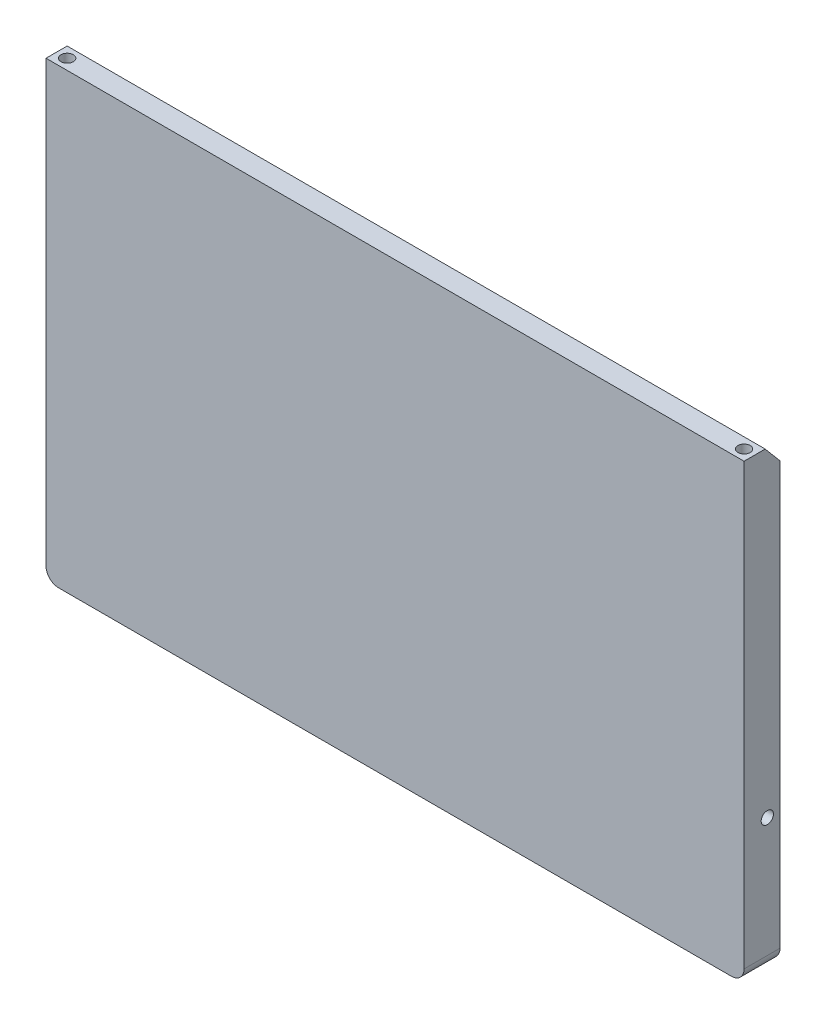
ISO-10303-21;
HEADER;
FILE_DESCRIPTION(('STEP AP214'),'2;1');
FILE_NAME('part.step','',(''),(''),'','','');
FILE_SCHEMA(('AUTOMOTIVE_DESIGN { 1 0 10303 214 1 1 1 1 }'));
ENDSEC;
DATA;
#1=APPLICATION_CONTEXT('core data for automotive mechanical design processes');
#2=APPLICATION_PROTOCOL_DEFINITION('international standard','automotive_design',2000,#1);
#3=PRODUCT_CONTEXT('',#1,'mechanical');
#4=PRODUCT('Part','Part','',(#3));
#5=PRODUCT_RELATED_PRODUCT_CATEGORY('part','',(#4));
#6=PRODUCT_DEFINITION_FORMATION('','',#4);
#7=PRODUCT_DEFINITION_CONTEXT('part definition',#1,'design');
#8=PRODUCT_DEFINITION('design','',#6,#7);
#9=PRODUCT_DEFINITION_SHAPE('','',#8);
#10=(LENGTH_UNIT() NAMED_UNIT(*) SI_UNIT(.MILLI.,.METRE.));
#11=(NAMED_UNIT(*) PLANE_ANGLE_UNIT() SI_UNIT($,.RADIAN.));
#12=(NAMED_UNIT(*) SI_UNIT($,.STERADIAN.) SOLID_ANGLE_UNIT());
#13=UNCERTAINTY_MEASURE_WITH_UNIT(LENGTH_MEASURE(1.E-05),#10,'distance_accuracy_value','');
#14=(GEOMETRIC_REPRESENTATION_CONTEXT(3) GLOBAL_UNCERTAINTY_ASSIGNED_CONTEXT((#13)) GLOBAL_UNIT_ASSIGNED_CONTEXT((#10,
#11,#12)) REPRESENTATION_CONTEXT('',''));
#15=CARTESIAN_POINT('',(0.,0.,0.));
#16=DIRECTION('',(0.,0.,1.));
#17=DIRECTION('',(1.,0.,0.));
#18=AXIS2_PLACEMENT_3D('',#15,#16,#17);
#19=CARTESIAN_POINT('',(-82.55,-80.8019491525424,5.));
#20=DIRECTION('',(1.,0.,0.));
#21=DIRECTION('',(0.,0.,-1.));
#22=AXIS2_PLACEMENT_3D('',#19,#20,#21);
#23=PLANE('',#22);
#24=CARTESIAN_POINT('',(-82.55,-66.5519491525424,-0.500000000000002));
#25=DIRECTION('',(1.,0.,0.));
#26=DIRECTION('',(0.,0.,-1.));
#27=AXIS2_PLACEMENT_3D('',#24,#25,#26);
#28=CIRCLE('',#27,1.44999999999999);
#29=CARTESIAN_POINT('',(-82.55,-66.5519491525424,-1.94999999999999));
#30=VERTEX_POINT('',#29);
#31=EDGE_CURVE('E232',#30,#30,#28,.T.);
#32=ORIENTED_EDGE('',*,*,#31,.T.);
#33=EDGE_LOOP('',(#32));
#34=FACE_BOUND('',#33,.T.);
#35=DIRECTION('',(0.,1.,0.));
#36=VECTOR('',#35,1.);
#37=CARTESIAN_POINT('',(-82.55,-80.8019491525424,-3.5));
#38=LINE('',#37,#36);
#39=CARTESIAN_POINT('',(-82.55,-94.8019491525424,-3.5));
#40=VERTEX_POINT('',#39);
#41=CARTESIAN_POINT('',(-82.55,5.02691327337787,-3.5));
#42=VERTEX_POINT('',#41);
#43=EDGE_CURVE('E173',#40,#42,#38,.T.);
#44=ORIENTED_EDGE('',*,*,#43,.F.);
#45=DIRECTION('',(0.,0.,-1.));
#46=VECTOR('',#45,1.);
#47=CARTESIAN_POINT('',(-82.55,-94.8019491525424,5.));
#48=LINE('',#47,#46);
#49=CARTESIAN_POINT('',(-82.55,-94.8019491525424,5.));
#50=VERTEX_POINT('',#49);
#51=EDGE_CURVE('E11',#40,#50,#48,.F.);
#52=ORIENTED_EDGE('',*,*,#51,.T.);
#53=DIRECTION('',(0.,-1.,0.));
#54=VECTOR('',#53,1.);
#55=CARTESIAN_POINT('',(-82.55,-80.8019491525424,5.));
#56=LINE('',#55,#54);
#57=CARTESIAN_POINT('',(-82.55,9.19805084745761,5.));
#58=VERTEX_POINT('',#57);
#59=EDGE_CURVE('E179',#58,#50,#56,.T.);
#60=ORIENTED_EDGE('',*,*,#59,.F.);
#61=DIRECTION('',(0.,0.,-1.));
#62=VECTOR('',#61,1.);
#63=CARTESIAN_POINT('',(-82.55,9.19805084745761,5.));
#64=LINE('',#63,#62);
#65=CARTESIAN_POINT('',(-82.55,9.19805084745761,0.));
#66=VERTEX_POINT('',#65);
#67=EDGE_CURVE('E194',#58,#66,#64,.T.);
#68=ORIENTED_EDGE('',*,*,#67,.T.);
#69=DIRECTION('',(0.,-0.766044443118977,-0.642787609686541));
#70=VECTOR('',#69,1.);
#71=CARTESIAN_POINT('',(-82.55,5.0269132733779,-3.49999999999999));
#72=LINE('',#71,#70);
#73=EDGE_CURVE('E207',#66,#42,#72,.T.);
#74=ORIENTED_EDGE('',*,*,#73,.T.);
#75=EDGE_LOOP('',(#44,#52,#60,#68,#74));
#76=FACE_BOUND('',#75,.T.);
#77=ADVANCED_FACE('F41',(#34,#76),#23,.F.);
#78=CARTESIAN_POINT('',(82.55,-80.8019491525424,5.));
#79=DIRECTION('',(-1.,0.,0.));
#80=DIRECTION('',(0.,-1.,0.));
#81=AXIS2_PLACEMENT_3D('',#78,#79,#80);
#82=PLANE('',#81);
#83=CARTESIAN_POINT('',(82.55,-66.5519491525424,-0.500000000000002));
#84=DIRECTION('',(1.,0.,0.));
#85=DIRECTION('',(0.,0.,-1.));
#86=AXIS2_PLACEMENT_3D('',#83,#84,#85);
#87=CIRCLE('',#86,1.44999999999999);
#88=CARTESIAN_POINT('',(82.55,-66.5519491525424,-1.94999999999999));
#89=VERTEX_POINT('',#88);
#90=EDGE_CURVE('E155',#89,#89,#87,.T.);
#91=ORIENTED_EDGE('',*,*,#90,.F.);
#92=EDGE_LOOP('',(#91));
#93=FACE_BOUND('',#92,.T.);
#94=DIRECTION('',(0.,1.,0.));
#95=VECTOR('',#94,1.);
#96=CARTESIAN_POINT('',(82.55,-80.8019491525424,5.));
#97=LINE('',#96,#95);
#98=CARTESIAN_POINT('',(82.55,-94.8019491525424,5.));
#99=VERTEX_POINT('',#98);
#100=CARTESIAN_POINT('',(82.55,9.19805084745763,5.));
#101=VERTEX_POINT('',#100);
#102=EDGE_CURVE('E190',#99,#101,#97,.T.);
#103=ORIENTED_EDGE('',*,*,#102,.F.);
#104=DIRECTION('',(0.,0.,1.));
#105=VECTOR('',#104,1.);
#106=CARTESIAN_POINT('',(82.55,-94.8019491525424,-3.5));
#107=LINE('',#106,#105);
#108=CARTESIAN_POINT('',(82.55,-94.8019491525423,-3.5));
#109=VERTEX_POINT('',#108);
#110=EDGE_CURVE('E64',#99,#109,#107,.F.);
#111=ORIENTED_EDGE('',*,*,#110,.T.);
#112=DIRECTION('',(0.,-1.,0.));
#113=VECTOR('',#112,1.);
#114=CARTESIAN_POINT('',(82.55,9.19805084745763,-3.5));
#115=LINE('',#114,#113);
#116=CARTESIAN_POINT('',(82.55,5.02691327337792,-3.5));
#117=VERTEX_POINT('',#116);
#118=EDGE_CURVE('E168',#117,#109,#115,.T.);
#119=ORIENTED_EDGE('',*,*,#118,.F.);
#120=DIRECTION('',(0.,0.766044443118977,0.642787609686541));
#121=VECTOR('',#120,1.);
#122=CARTESIAN_POINT('',(82.55,5.02691327337792,-3.49999999999999));
#123=LINE('',#122,#121);
#124=CARTESIAN_POINT('',(82.55,9.19805084745763,0.));
#125=VERTEX_POINT('',#124);
#126=EDGE_CURVE('E203',#117,#125,#123,.T.);
#127=ORIENTED_EDGE('',*,*,#126,.T.);
#128=DIRECTION('',(0.,0.,-1.));
#129=VECTOR('',#128,1.);
#130=CARTESIAN_POINT('',(82.55,9.19805084745763,5.));
#131=LINE('',#130,#129);
#132=EDGE_CURVE('E197',#101,#125,#131,.T.);
#133=ORIENTED_EDGE('',*,*,#132,.F.);
#134=EDGE_LOOP('',(#103,#111,#119,#127,#133));
#135=FACE_BOUND('',#134,.T.);
#136=ADVANCED_FACE('F239',(#93,#135),#82,.F.);
#137=CARTESIAN_POINT('',(-82.55,9.19805084745761,5.));
#138=DIRECTION('',(0.,-1.,0.));
#139=DIRECTION('',(1.,0.,0.));
#140=AXIS2_PLACEMENT_3D('',#137,#138,#139);
#141=PLANE('',#140);
#142=CARTESIAN_POINT('',(80.05,9.19805084745762,2.5));
#143=DIRECTION('',(0.,1.,0.));
#144=DIRECTION('',(0.,0.,1.));
#145=AXIS2_PLACEMENT_3D('',#142,#143,#144);
#146=CIRCLE('',#145,1.45);
#147=CARTESIAN_POINT('',(80.05,9.19805084745762,3.95));
#148=VERTEX_POINT('',#147);
#149=EDGE_CURVE('E180',#148,#148,#146,.T.);
#150=ORIENTED_EDGE('',*,*,#149,.F.);
#151=EDGE_LOOP('',(#150));
#152=FACE_BOUND('',#151,.T.);
#153=CARTESIAN_POINT('',(-80.05,9.19805084745762,2.5));
#154=DIRECTION('',(0.,1.,0.));
#155=DIRECTION('',(0.,0.,1.));
#156=AXIS2_PLACEMENT_3D('',#153,#154,#155);
#157=CIRCLE('',#156,1.45);
#158=CARTESIAN_POINT('',(-80.05,9.19805084745762,3.95));
#159=VERTEX_POINT('',#158);
#160=EDGE_CURVE('E183',#159,#159,#157,.T.);
#161=ORIENTED_EDGE('',*,*,#160,.F.);
#162=EDGE_LOOP('',(#161));
#163=FACE_BOUND('',#162,.T.);
#164=ORIENTED_EDGE('',*,*,#132,.T.);
#165=DIRECTION('',(-1.,0.,0.));
#166=VECTOR('',#165,1.);
#167=CARTESIAN_POINT('',(-82.55,9.19805084745761,0.));
#168=LINE('',#167,#166);
#169=EDGE_CURVE('E205',#125,#66,#168,.T.);
#170=ORIENTED_EDGE('',*,*,#169,.T.);
#171=ORIENTED_EDGE('',*,*,#67,.F.);
#172=DIRECTION('',(-1.,0.,0.));
#173=VECTOR('',#172,1.);
#174=CARTESIAN_POINT('',(-82.55,9.19805084745761,5.));
#175=LINE('',#174,#173);
#176=EDGE_CURVE('E192',#101,#58,#175,.T.);
#177=ORIENTED_EDGE('',*,*,#176,.F.);
#178=EDGE_LOOP('',(#164,#170,#171,#177));
#179=FACE_BOUND('',#178,.T.);
#180=ADVANCED_FACE('F244',(#152,#163,#179),#141,.F.);
#181=CARTESIAN_POINT('',(0.,0.,5.));
#182=DIRECTION('',(0.,0.,-1.));
#183=DIRECTION('',(-1.,0.,0.));
#184=AXIS2_PLACEMENT_3D('',#181,#182,#183);
#185=PLANE('',#184);
#186=DIRECTION('',(-1.,0.,0.));
#187=VECTOR('',#186,1.);
#188=CARTESIAN_POINT('',(82.55,-97.8019491525424,5.));
#189=LINE('',#188,#187);
#190=CARTESIAN_POINT('',(79.55,-97.8019491525424,5.));
#191=VERTEX_POINT('',#190);
#192=CARTESIAN_POINT('',(-79.55,-97.8019491525424,5.));
#193=VERTEX_POINT('',#192);
#194=EDGE_CURVE('E233',#191,#193,#189,.T.);
#195=ORIENTED_EDGE('',*,*,#194,.F.);
#196=CARTESIAN_POINT('',(79.55,-94.8019491525424,5.));
#197=DIRECTION('',(0.,0.,-1.));
#198=DIRECTION('',(-1.,0.,0.));
#199=AXIS2_PLACEMENT_3D('',#196,#197,#198);
#200=CIRCLE('',#199,3.);
#201=EDGE_CURVE('E218',#191,#99,#200,.F.);
#202=ORIENTED_EDGE('',*,*,#201,.T.);
#203=ORIENTED_EDGE('',*,*,#102,.T.);
#204=ORIENTED_EDGE('',*,*,#176,.T.);
#205=ORIENTED_EDGE('',*,*,#59,.T.);
#206=CARTESIAN_POINT('',(-79.55,-94.8019491525424,5.));
#207=DIRECTION('',(0.,0.,-1.));
#208=DIRECTION('',(-1.,0.,0.));
#209=AXIS2_PLACEMENT_3D('',#206,#207,#208);
#210=CIRCLE('',#209,3.);
#211=EDGE_CURVE('E216',#50,#193,#210,.F.);
#212=ORIENTED_EDGE('',*,*,#211,.T.);
#213=EDGE_LOOP('',(#195,#202,#203,#204,#205,#212));
#214=FACE_BOUND('',#213,.T.);
#215=ADVANCED_FACE('F237',(#214),#185,.F.);
#216=CARTESIAN_POINT('',(-80.05,2.19805084745762,2.5));
#217=DIRECTION('',(0.,1.,0.));
#218=DIRECTION('',(0.,0.,1.));
#219=AXIS2_PLACEMENT_3D('',#216,#217,#218);
#220=CYLINDRICAL_SURFACE('',#219,1.45);
#221=CARTESIAN_POINT('',(-80.05,2.19805084745762,2.5));
#222=DIRECTION('',(0.,1.,0.));
#223=DIRECTION('',(0.,0.,1.));
#224=AXIS2_PLACEMENT_3D('',#221,#222,#223);
#225=CIRCLE('',#224,1.45);
#226=CARTESIAN_POINT('',(-80.05,2.19805084745762,3.95));
#227=VERTEX_POINT('',#226);
#228=EDGE_CURVE('E175',#227,#227,#225,.T.);
#229=ORIENTED_EDGE('',*,*,#228,.F.);
#230=EDGE_LOOP('',(#229));
#231=FACE_BOUND('',#230,.T.);
#232=ORIENTED_EDGE('',*,*,#160,.T.);
#233=EDGE_LOOP('',(#232));
#234=FACE_BOUND('',#233,.T.);
#235=ADVANCED_FACE('F281',(#231,#234),#220,.F.);
#236=CARTESIAN_POINT('',(-80.05,2.19805084745762,2.5));
#237=DIRECTION('',(0.,1.,0.));
#238=DIRECTION('',(0.,0.,1.));
#239=AXIS2_PLACEMENT_3D('',#236,#237,#238);
#240=PLANE('',#239);
#241=ORIENTED_EDGE('',*,*,#228,.T.);
#242=EDGE_LOOP('',(#241));
#243=FACE_BOUND('',#242,.T.);
#244=ADVANCED_FACE('F282',(#243),#240,.T.);
#245=CARTESIAN_POINT('',(80.05,2.19805084745762,2.5));
#246=DIRECTION('',(0.,1.,0.));
#247=DIRECTION('',(0.,0.,1.));
#248=AXIS2_PLACEMENT_3D('',#245,#246,#247);
#249=CYLINDRICAL_SURFACE('',#248,1.45);
#250=CARTESIAN_POINT('',(80.05,2.19805084745762,2.5));
#251=DIRECTION('',(0.,1.,0.));
#252=DIRECTION('',(0.,0.,1.));
#253=AXIS2_PLACEMENT_3D('',#250,#251,#252);
#254=CIRCLE('',#253,1.45);
#255=CARTESIAN_POINT('',(80.05,2.19805084745762,3.95));
#256=VERTEX_POINT('',#255);
#257=EDGE_CURVE('E176',#256,#256,#254,.T.);
#258=ORIENTED_EDGE('',*,*,#257,.F.);
#259=EDGE_LOOP('',(#258));
#260=FACE_BOUND('',#259,.T.);
#261=ORIENTED_EDGE('',*,*,#149,.T.);
#262=EDGE_LOOP('',(#261));
#263=FACE_BOUND('',#262,.T.);
#264=ADVANCED_FACE('F285',(#260,#263),#249,.F.);
#265=CARTESIAN_POINT('',(80.05,2.19805084745762,2.5));
#266=DIRECTION('',(0.,1.,0.));
#267=DIRECTION('',(0.,0.,1.));
#268=AXIS2_PLACEMENT_3D('',#265,#266,#267);
#269=PLANE('',#268);
#270=ORIENTED_EDGE('',*,*,#257,.T.);
#271=EDGE_LOOP('',(#270));
#272=FACE_BOUND('',#271,.T.);
#273=ADVANCED_FACE('F262',(#272),#269,.T.);
#274=CARTESIAN_POINT('',(0.,0.,-3.5));
#275=DIRECTION('',(0.,0.,-1.));
#276=DIRECTION('',(-1.,0.,0.));
#277=AXIS2_PLACEMENT_3D('',#274,#275,#276);
#278=PLANE('',#277);
#279=DIRECTION('',(0.,-1.,0.));
#280=VECTOR('',#279,1.);
#281=CARTESIAN_POINT('',(50.1,3.79805084745766,-3.5));
#282=LINE('',#281,#280);
#283=CARTESIAN_POINT('',(50.1,3.79805084745766,-3.5));
#284=VERTEX_POINT('',#283);
#285=CARTESIAN_POINT('',(50.1,-75.4019491525423,-3.5));
#286=VERTEX_POINT('',#285);
#287=EDGE_CURVE('E132',#284,#286,#282,.T.);
#288=ORIENTED_EDGE('',*,*,#287,.F.);
#289=DIRECTION('',(1.,0.,0.));
#290=VECTOR('',#289,1.);
#291=CARTESIAN_POINT('',(50.1,3.79805084745766,-3.5));
#292=LINE('',#291,#290);
#293=CARTESIAN_POINT('',(-50.1,3.79805084745767,-3.5));
#294=VERTEX_POINT('',#293);
#295=EDGE_CURVE('E149',#294,#284,#292,.T.);
#296=ORIENTED_EDGE('',*,*,#295,.F.);
#297=DIRECTION('',(0.,1.,0.));
#298=VECTOR('',#297,1.);
#299=CARTESIAN_POINT('',(-50.1,3.79805084745767,-3.5));
#300=LINE('',#299,#298);
#301=CARTESIAN_POINT('',(-50.1,-75.4019491525424,-3.5));
#302=VERTEX_POINT('',#301);
#303=EDGE_CURVE('E152',#302,#294,#300,.T.);
#304=ORIENTED_EDGE('',*,*,#303,.F.);
#305=DIRECTION('',(-1.,0.,0.));
#306=VECTOR('',#305,1.);
#307=CARTESIAN_POINT('',(50.1,-75.4019491525423,-3.5));
#308=LINE('',#307,#306);
#309=EDGE_CURVE('E161',#286,#302,#308,.T.);
#310=ORIENTED_EDGE('',*,*,#309,.F.);
#311=EDGE_LOOP('',(#288,#296,#304,#310));
#312=FACE_BOUND('',#311,.T.);
#313=ORIENTED_EDGE('',*,*,#118,.T.);
#314=CARTESIAN_POINT('',(79.55,-94.8019491525424,-3.5));
#315=DIRECTION('',(0.,0.,-1.));
#316=DIRECTION('',(-1.,0.,0.));
#317=AXIS2_PLACEMENT_3D('',#314,#315,#316);
#318=CIRCLE('',#317,3.);
#319=CARTESIAN_POINT('',(79.55,-97.8019491525424,-3.5));
#320=VERTEX_POINT('',#319);
#321=EDGE_CURVE('E49',#109,#320,#318,.T.);
#322=ORIENTED_EDGE('',*,*,#321,.T.);
#323=DIRECTION('',(1.,0.,0.));
#324=VECTOR('',#323,1.);
#325=CARTESIAN_POINT('',(-82.55,-97.8019491525424,-3.5));
#326=LINE('',#325,#324);
#327=CARTESIAN_POINT('',(-79.55,-97.8019491525424,-3.5));
#328=VERTEX_POINT('',#327);
#329=EDGE_CURVE('E224',#328,#320,#326,.T.);
#330=ORIENTED_EDGE('',*,*,#329,.F.);
#331=CARTESIAN_POINT('',(-79.55,-94.8019491525424,-3.5));
#332=DIRECTION('',(0.,0.,-1.));
#333=DIRECTION('',(-1.,0.,0.));
#334=AXIS2_PLACEMENT_3D('',#331,#332,#333);
#335=CIRCLE('',#334,3.);
#336=EDGE_CURVE('E56',#328,#40,#335,.T.);
#337=ORIENTED_EDGE('',*,*,#336,.T.);
#338=ORIENTED_EDGE('',*,*,#43,.T.);
#339=DIRECTION('',(1.,0.,0.));
#340=VECTOR('',#339,1.);
#341=CARTESIAN_POINT('',(82.55,5.02691327337791,-3.5));
#342=LINE('',#341,#340);
#343=EDGE_CURVE('E200',#42,#117,#342,.T.);
#344=ORIENTED_EDGE('',*,*,#343,.T.);
#345=EDGE_LOOP('',(#313,#322,#330,#337,#338,#344));
#346=FACE_BOUND('',#345,.T.);
#347=ADVANCED_FACE('F223',(#312,#346),#278,.T.);
#348=CARTESIAN_POINT('',(0.,5.0269132733779,-3.5));
#349=DIRECTION('',(0.,0.642787609686541,-0.766044443118977));
#350=DIRECTION('',(-1.,0.,0.));
#351=AXIS2_PLACEMENT_3D('',#348,#349,#350);
#352=PLANE('',#351);
#353=ORIENTED_EDGE('',*,*,#73,.F.);
#354=ORIENTED_EDGE('',*,*,#169,.F.);
#355=ORIENTED_EDGE('',*,*,#126,.F.);
#356=ORIENTED_EDGE('',*,*,#343,.F.);
#357=EDGE_LOOP('',(#353,#354,#355,#356));
#358=FACE_BOUND('',#357,.T.);
#359=ADVANCED_FACE('F253',(#358),#352,.T.);
#360=CARTESIAN_POINT('',(50.1,3.79805084745766,3.));
#361=DIRECTION('',(1.,0.,0.));
#362=DIRECTION('',(0.,1.,0.));
#363=AXIS2_PLACEMENT_3D('',#360,#361,#362);
#364=PLANE('',#363);
#365=ORIENTED_EDGE('',*,*,#287,.T.);
#366=DIRECTION('',(0.,0.,-1.));
#367=VECTOR('',#366,1.);
#368=CARTESIAN_POINT('',(50.1,-75.4019491525423,3.));
#369=LINE('',#368,#367);
#370=CARTESIAN_POINT('',(50.1,-75.4019491525423,3.));
#371=VERTEX_POINT('',#370);
#372=EDGE_CURVE('E125',#371,#286,#369,.T.);
#373=ORIENTED_EDGE('',*,*,#372,.F.);
#374=DIRECTION('',(0.,-1.,0.));
#375=VECTOR('',#374,1.);
#376=CARTESIAN_POINT('',(50.1,3.79805084745766,3.));
#377=LINE('',#376,#375);
#378=CARTESIAN_POINT('',(50.1,3.79805084745766,3.));
#379=VERTEX_POINT('',#378);
#380=EDGE_CURVE('E129',#379,#371,#377,.T.);
#381=ORIENTED_EDGE('',*,*,#380,.F.);
#382=DIRECTION('',(0.,0.,-1.));
#383=VECTOR('',#382,1.);
#384=CARTESIAN_POINT('',(50.1,3.79805084745766,3.));
#385=LINE('',#384,#383);
#386=EDGE_CURVE('E166',#379,#284,#385,.T.);
#387=ORIENTED_EDGE('',*,*,#386,.T.);
#388=EDGE_LOOP('',(#365,#373,#381,#387));
#389=FACE_BOUND('',#388,.T.);
#390=ADVANCED_FACE('F127',(#389),#364,.F.);
#391=CARTESIAN_POINT('',(50.1,3.79805084745766,3.));
#392=DIRECTION('',(0.,1.,0.));
#393=DIRECTION('',(-1.,0.,0.));
#394=AXIS2_PLACEMENT_3D('',#391,#392,#393);
#395=PLANE('',#394);
#396=ORIENTED_EDGE('',*,*,#295,.T.);
#397=ORIENTED_EDGE('',*,*,#386,.F.);
#398=DIRECTION('',(1.,0.,0.));
#399=VECTOR('',#398,1.);
#400=CARTESIAN_POINT('',(50.1,3.79805084745766,3.));
#401=LINE('',#400,#399);
#402=CARTESIAN_POINT('',(-50.1,3.79805084745767,3.));
#403=VERTEX_POINT('',#402);
#404=EDGE_CURVE('E137',#403,#379,#401,.T.);
#405=ORIENTED_EDGE('',*,*,#404,.F.);
#406=DIRECTION('',(0.,0.,-1.));
#407=VECTOR('',#406,1.);
#408=CARTESIAN_POINT('',(-50.1,3.79805084745767,3.));
#409=LINE('',#408,#407);
#410=EDGE_CURVE('E169',#403,#294,#409,.T.);
#411=ORIENTED_EDGE('',*,*,#410,.T.);
#412=EDGE_LOOP('',(#396,#397,#405,#411));
#413=FACE_BOUND('',#412,.T.);
#414=ADVANCED_FACE('F260',(#413),#395,.F.);
#415=CARTESIAN_POINT('',(-50.1,3.79805084745767,3.));
#416=DIRECTION('',(-1.,0.,0.));
#417=DIRECTION('',(0.,0.,1.));
#418=AXIS2_PLACEMENT_3D('',#415,#416,#417);
#419=PLANE('',#418);
#420=ORIENTED_EDGE('',*,*,#303,.T.);
#421=ORIENTED_EDGE('',*,*,#410,.F.);
#422=DIRECTION('',(0.,1.,0.));
#423=VECTOR('',#422,1.);
#424=CARTESIAN_POINT('',(-50.1,3.79805084745767,3.));
#425=LINE('',#424,#423);
#426=CARTESIAN_POINT('',(-50.1,-75.4019491525424,3.));
#427=VERTEX_POINT('',#426);
#428=EDGE_CURVE('E145',#427,#403,#425,.T.);
#429=ORIENTED_EDGE('',*,*,#428,.F.);
#430=DIRECTION('',(0.,0.,-1.));
#431=VECTOR('',#430,1.);
#432=CARTESIAN_POINT('',(-50.1,-75.4019491525424,3.));
#433=LINE('',#432,#431);
#434=EDGE_CURVE('E136',#427,#302,#433,.T.);
#435=ORIENTED_EDGE('',*,*,#434,.T.);
#436=EDGE_LOOP('',(#420,#421,#429,#435));
#437=FACE_BOUND('',#436,.T.);
#438=ADVANCED_FACE('F298',(#437),#419,.F.);
#439=CARTESIAN_POINT('',(50.1,-75.4019491525423,3.));
#440=DIRECTION('',(0.,-1.,0.));
#441=DIRECTION('',(1.,0.,0.));
#442=AXIS2_PLACEMENT_3D('',#439,#440,#441);
#443=PLANE('',#442);
#444=ORIENTED_EDGE('',*,*,#309,.T.);
#445=ORIENTED_EDGE('',*,*,#434,.F.);
#446=DIRECTION('',(-1.,0.,0.));
#447=VECTOR('',#446,1.);
#448=CARTESIAN_POINT('',(50.1,-75.4019491525423,3.));
#449=LINE('',#448,#447);
#450=EDGE_CURVE('E140',#371,#427,#449,.T.);
#451=ORIENTED_EDGE('',*,*,#450,.F.);
#452=ORIENTED_EDGE('',*,*,#372,.T.);
#453=EDGE_LOOP('',(#444,#445,#451,#452));
#454=FACE_BOUND('',#453,.T.);
#455=ADVANCED_FACE('F141',(#454),#443,.F.);
#456=CARTESIAN_POINT('',(0.,0.,3.));
#457=DIRECTION('',(0.,0.,-1.));
#458=DIRECTION('',(-1.,0.,0.));
#459=AXIS2_PLACEMENT_3D('',#456,#457,#458);
#460=PLANE('',#459);
#461=ORIENTED_EDGE('',*,*,#380,.T.);
#462=ORIENTED_EDGE('',*,*,#450,.T.);
#463=ORIENTED_EDGE('',*,*,#428,.T.);
#464=ORIENTED_EDGE('',*,*,#404,.T.);
#465=EDGE_LOOP('',(#461,#462,#463,#464));
#466=FACE_BOUND('',#465,.T.);
#467=ADVANCED_FACE('F147',(#466),#460,.T.);
#468=CARTESIAN_POINT('',(79.55,-66.5519491525424,-0.500000000000002));
#469=DIRECTION('',(1.,0.,0.));
#470=DIRECTION('',(0.,0.,-1.));
#471=AXIS2_PLACEMENT_3D('',#468,#469,#470);
#472=CYLINDRICAL_SURFACE('',#471,1.44999999999999);
#473=CARTESIAN_POINT('',(79.55,-66.5519491525424,-0.500000000000002));
#474=DIRECTION('',(1.,0.,0.));
#475=DIRECTION('',(0.,0.,-1.));
#476=AXIS2_PLACEMENT_3D('',#473,#474,#475);
#477=CIRCLE('',#476,1.44999999999999);
#478=CARTESIAN_POINT('',(79.55,-66.5519491525424,-1.94999999999999));
#479=VERTEX_POINT('',#478);
#480=EDGE_CURVE('E162',#479,#479,#477,.T.);
#481=ORIENTED_EDGE('',*,*,#480,.F.);
#482=EDGE_LOOP('',(#481));
#483=FACE_BOUND('',#482,.T.);
#484=ORIENTED_EDGE('',*,*,#90,.T.);
#485=EDGE_LOOP('',(#484));
#486=FACE_BOUND('',#485,.T.);
#487=ADVANCED_FACE('F307',(#483,#486),#472,.F.);
#488=CARTESIAN_POINT('',(79.55,-66.5519491525424,-0.500000000000002));
#489=DIRECTION('',(1.,0.,0.));
#490=DIRECTION('',(0.,0.,-1.));
#491=AXIS2_PLACEMENT_3D('',#488,#489,#490);
#492=PLANE('',#491);
#493=ORIENTED_EDGE('',*,*,#480,.T.);
#494=EDGE_LOOP('',(#493));
#495=FACE_BOUND('',#494,.T.);
#496=ADVANCED_FACE('F310',(#495),#492,.T.);
#497=CARTESIAN_POINT('',(-79.55,-66.5519491525424,-0.500000000000002));
#498=DIRECTION('',(-1.,0.,0.));
#499=DIRECTION('',(0.,0.,1.));
#500=AXIS2_PLACEMENT_3D('',#497,#498,#499);
#501=CYLINDRICAL_SURFACE('',#500,1.44999999999999);
#502=CARTESIAN_POINT('',(-79.55,-66.5519491525424,-0.500000000000002));
#503=DIRECTION('',(1.,0.,0.));
#504=DIRECTION('',(0.,0.,-1.));
#505=AXIS2_PLACEMENT_3D('',#502,#503,#504);
#506=CIRCLE('',#505,1.44999999999999);
#507=CARTESIAN_POINT('',(-79.55,-66.5519491525424,-1.94999999999999));
#508=VERTEX_POINT('',#507);
#509=EDGE_CURVE('E565',#508,#508,#506,.T.);
#510=ORIENTED_EDGE('',*,*,#509,.T.);
#511=EDGE_LOOP('',(#510));
#512=FACE_BOUND('',#511,.T.);
#513=ORIENTED_EDGE('',*,*,#31,.F.);
#514=EDGE_LOOP('',(#513));
#515=FACE_BOUND('',#514,.T.);
#516=ADVANCED_FACE('F314',(#512,#515),#501,.F.);
#517=CARTESIAN_POINT('',(-79.55,-66.5519491525424,-0.500000000000002));
#518=DIRECTION('',(-1.,0.,0.));
#519=DIRECTION('',(0.,0.,-1.));
#520=AXIS2_PLACEMENT_3D('',#517,#518,#519);
#521=PLANE('',#520);
#522=ORIENTED_EDGE('',*,*,#509,.F.);
#523=EDGE_LOOP('',(#522));
#524=FACE_BOUND('',#523,.T.);
#525=ADVANCED_FACE('F318',(#524),#521,.T.);
#526=CARTESIAN_POINT('',(0.,-97.8019491525424,0.));
#527=DIRECTION('',(0.,-1.,0.));
#528=DIRECTION('',(1.,0.,0.));
#529=AXIS2_PLACEMENT_3D('',#526,#527,#528);
#530=PLANE('',#529);
#531=ORIENTED_EDGE('',*,*,#329,.T.);
#532=DIRECTION('',(0.,0.,1.));
#533=VECTOR('',#532,1.);
#534=CARTESIAN_POINT('',(79.55,-97.8019491525424,5.));
#535=LINE('',#534,#533);
#536=EDGE_CURVE('E213',#320,#191,#535,.T.);
#537=ORIENTED_EDGE('',*,*,#536,.T.);
#538=ORIENTED_EDGE('',*,*,#194,.T.);
#539=DIRECTION('',(0.,0.,-1.));
#540=VECTOR('',#539,1.);
#541=CARTESIAN_POINT('',(-79.55,-97.8019491525424,-3.5));
#542=LINE('',#541,#540);
#543=EDGE_CURVE('E210',#193,#328,#542,.T.);
#544=ORIENTED_EDGE('',*,*,#543,.T.);
#545=EDGE_LOOP('',(#531,#537,#538,#544));
#546=FACE_BOUND('',#545,.T.);
#547=ADVANCED_FACE('F228',(#546),#530,.T.);
#548=CARTESIAN_POINT('',(79.55,-94.8019491525424,0.));
#549=DIRECTION('',(0.,0.,-1.));
#550=DIRECTION('',(-1.,0.,0.));
#551=AXIS2_PLACEMENT_3D('',#548,#549,#550);
#552=CYLINDRICAL_SURFACE('',#551,3.);
#553=ORIENTED_EDGE('',*,*,#321,.F.);
#554=ORIENTED_EDGE('',*,*,#110,.F.);
#555=ORIENTED_EDGE('',*,*,#201,.F.);
#556=ORIENTED_EDGE('',*,*,#536,.F.);
#557=EDGE_LOOP('',(#553,#554,#555,#556));
#558=FACE_BOUND('',#557,.T.);
#559=ADVANCED_FACE('F235',(#558),#552,.T.);
#560=CARTESIAN_POINT('',(-79.55,-94.8019491525424,0.));
#561=DIRECTION('',(0.,0.,1.));
#562=DIRECTION('',(1.,0.,0.));
#563=AXIS2_PLACEMENT_3D('',#560,#561,#562);
#564=CYLINDRICAL_SURFACE('',#563,3.);
#565=ORIENTED_EDGE('',*,*,#211,.F.);
#566=ORIENTED_EDGE('',*,*,#51,.F.);
#567=ORIENTED_EDGE('',*,*,#336,.F.);
#568=ORIENTED_EDGE('',*,*,#543,.F.);
#569=EDGE_LOOP('',(#565,#566,#567,#568));
#570=FACE_BOUND('',#569,.T.);
#571=ADVANCED_FACE('F43',(#570),#564,.T.);
#572=CLOSED_SHELL('',(#77,#136,#180,#215,#235,#244,#264,#273,#347,#359,#390,#414,#438,#455,#467,
#487,#496,#516,#525,#547,#559,#571));
#573=MANIFOLD_SOLID_BREP('B2',#572);
#574=ADVANCED_BREP_SHAPE_REPRESENTATION('',(#18,#573),#14);
#575=SHAPE_DEFINITION_REPRESENTATION(#9,#574);
ENDSEC;
END-ISO-10303-21;
